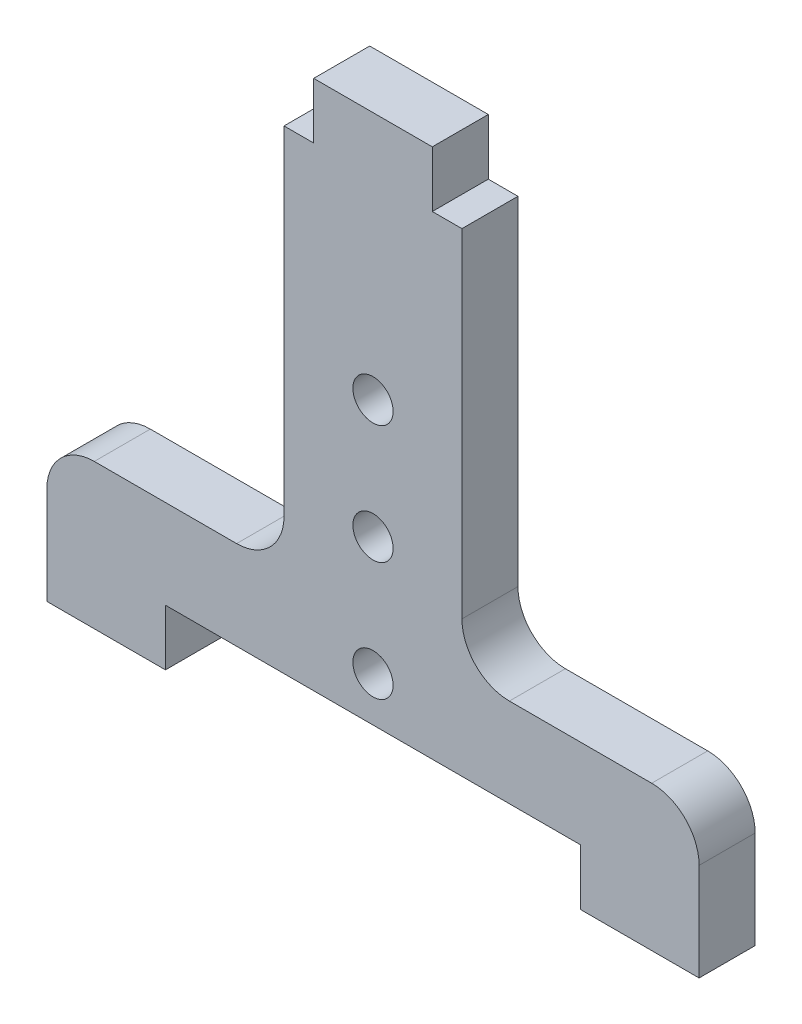
ISO-10303-21;
HEADER;
FILE_DESCRIPTION(('STEP AP214'),'2;1');
FILE_NAME('part.step','',(''),(''),'','','');
FILE_SCHEMA(('AUTOMOTIVE_DESIGN { 1 0 10303 214 1 1 1 1 }'));
ENDSEC;
DATA;
#1=APPLICATION_CONTEXT('core data for automotive mechanical design processes');
#2=APPLICATION_PROTOCOL_DEFINITION('international standard','automotive_design',2000,#1);
#3=PRODUCT_CONTEXT('',#1,'mechanical');
#4=PRODUCT('Part','Part','',(#3));
#5=PRODUCT_RELATED_PRODUCT_CATEGORY('part','',(#4));
#6=PRODUCT_DEFINITION_FORMATION('','',#4);
#7=PRODUCT_DEFINITION_CONTEXT('part definition',#1,'design');
#8=PRODUCT_DEFINITION('design','',#6,#7);
#9=PRODUCT_DEFINITION_SHAPE('','',#8);
#10=(LENGTH_UNIT() NAMED_UNIT(*) SI_UNIT(.MILLI.,.METRE.));
#11=(NAMED_UNIT(*) PLANE_ANGLE_UNIT() SI_UNIT($,.RADIAN.));
#12=(NAMED_UNIT(*) SI_UNIT($,.STERADIAN.) SOLID_ANGLE_UNIT());
#13=UNCERTAINTY_MEASURE_WITH_UNIT(LENGTH_MEASURE(1.E-05),#10,'distance_accuracy_value','');
#14=(GEOMETRIC_REPRESENTATION_CONTEXT(3) GLOBAL_UNCERTAINTY_ASSIGNED_CONTEXT((#13)) GLOBAL_UNIT_ASSIGNED_CONTEXT((#10,
#11,#12)) REPRESENTATION_CONTEXT('',''));
#15=CARTESIAN_POINT('',(0.,0.,0.));
#16=DIRECTION('',(0.,0.,1.));
#17=DIRECTION('',(1.,0.,0.));
#18=AXIS2_PLACEMENT_3D('',#15,#16,#17);
#19=CARTESIAN_POINT('',(-34.925,-25.4,5.999988));
#20=DIRECTION('',(0.,1.,0.));
#21=DIRECTION('',(0.,0.,1.));
#22=AXIS2_PLACEMENT_3D('',#19,#20,#21);
#23=PLANE('',#22);
#24=DIRECTION('',(1.,0.,0.));
#25=VECTOR('',#24,1.);
#26=CARTESIAN_POINT('',(-34.925,-25.4,0.));
#27=LINE('',#26,#25);
#28=CARTESIAN_POINT('',(-22.225,-25.4,0.));
#29=VERTEX_POINT('',#28);
#30=CARTESIAN_POINT('',(22.225,-25.4,0.));
#31=VERTEX_POINT('',#30);
#32=EDGE_CURVE('E250',#29,#31,#27,.T.);
#33=ORIENTED_EDGE('',*,*,#32,.T.);
#34=DIRECTION('',(0.,0.,1.));
#35=VECTOR('',#34,1.);
#36=CARTESIAN_POINT('',(22.225,-25.4,0.));
#37=LINE('',#36,#35);
#38=CARTESIAN_POINT('',(22.225,-25.4,5.999988));
#39=VERTEX_POINT('',#38);
#40=EDGE_CURVE('E304',#31,#39,#37,.T.);
#41=ORIENTED_EDGE('',*,*,#40,.T.);
#42=DIRECTION('',(1.,0.,0.));
#43=VECTOR('',#42,1.);
#44=CARTESIAN_POINT('',(-34.925,-25.4,5.999988));
#45=LINE('',#44,#43);
#46=CARTESIAN_POINT('',(-22.225,-25.4,5.999988));
#47=VERTEX_POINT('',#46);
#48=EDGE_CURVE('E199',#47,#39,#45,.T.);
#49=ORIENTED_EDGE('',*,*,#48,.F.);
#50=DIRECTION('',(0.,0.,1.));
#51=VECTOR('',#50,1.);
#52=CARTESIAN_POINT('',(-22.225,-25.4,0.));
#53=LINE('',#52,#51);
#54=EDGE_CURVE('E247',#29,#47,#53,.T.);
#55=ORIENTED_EDGE('',*,*,#54,.F.);
#56=EDGE_LOOP('',(#33,#41,#49,#55));
#57=FACE_BOUND('',#56,.T.);
#58=ADVANCED_FACE('F33',(#57),#23,.F.);
#59=CARTESIAN_POINT('',(-34.925,25.4,5.999988));
#60=DIRECTION('',(0.,-1.,0.));
#61=DIRECTION('',(0.,0.,-1.));
#62=AXIS2_PLACEMENT_3D('',#59,#60,#61);
#63=PLANE('',#62);
#64=DIRECTION('',(-1.,0.,0.));
#65=VECTOR('',#64,1.);
#66=CARTESIAN_POINT('',(-34.925,25.4,0.));
#67=LINE('',#66,#65);
#68=CARTESIAN_POINT('',(-6.35,25.4,0.));
#69=VERTEX_POINT('',#68);
#70=CARTESIAN_POINT('',(-9.525,25.4,0.));
#71=VERTEX_POINT('',#70);
#72=EDGE_CURVE('E218',#69,#71,#67,.T.);
#73=ORIENTED_EDGE('',*,*,#72,.T.);
#74=DIRECTION('',(0.,0.,1.));
#75=VECTOR('',#74,1.);
#76=CARTESIAN_POINT('',(-9.525,25.4,-4.99999999997031E-05));
#77=LINE('',#76,#75);
#78=CARTESIAN_POINT('',(-9.525,25.4,5.999988));
#79=VERTEX_POINT('',#78);
#80=EDGE_CURVE('E293',#71,#79,#77,.T.);
#81=ORIENTED_EDGE('',*,*,#80,.T.);
#82=DIRECTION('',(-1.,0.,0.));
#83=VECTOR('',#82,1.);
#84=CARTESIAN_POINT('',(-34.925,25.4,5.999988));
#85=LINE('',#84,#83);
#86=CARTESIAN_POINT('',(-6.35,25.4,5.999988));
#87=VERTEX_POINT('',#86);
#88=EDGE_CURVE('E197',#87,#79,#85,.T.);
#89=ORIENTED_EDGE('',*,*,#88,.F.);
#90=DIRECTION('',(0.,0.,1.));
#91=VECTOR('',#90,1.);
#92=CARTESIAN_POINT('',(-6.35,25.4,0.));
#93=LINE('',#92,#91);
#94=EDGE_CURVE('E230',#69,#87,#93,.T.);
#95=ORIENTED_EDGE('',*,*,#94,.F.);
#96=EDGE_LOOP('',(#73,#81,#89,#95));
#97=FACE_BOUND('',#96,.T.);
#98=ADVANCED_FACE('F372',(#97),#63,.F.);
#99=CARTESIAN_POINT('',(34.925,-25.4,5.999988));
#100=DIRECTION('',(-1.,0.,0.));
#101=DIRECTION('',(0.,0.,1.));
#102=AXIS2_PLACEMENT_3D('',#99,#100,#101);
#103=PLANE('',#102);
#104=DIRECTION('',(0.,1.,0.));
#105=VECTOR('',#104,1.);
#106=CARTESIAN_POINT('',(34.925,-25.4,0.));
#107=LINE('',#106,#105);
#108=CARTESIAN_POINT('',(34.925,-31.399988,0.));
#109=VERTEX_POINT('',#108);
#110=CARTESIAN_POINT('',(34.925,-20.955,0.));
#111=VERTEX_POINT('',#110);
#112=EDGE_CURVE('E259',#109,#111,#107,.T.);
#113=ORIENTED_EDGE('',*,*,#112,.T.);
#114=DIRECTION('',(0.,0.,1.));
#115=VECTOR('',#114,1.);
#116=CARTESIAN_POINT('',(34.925,-20.955,5.999988));
#117=LINE('',#116,#115);
#118=CARTESIAN_POINT('',(34.925,-20.955,5.999988));
#119=VERTEX_POINT('',#118);
#120=EDGE_CURVE('E446',#111,#119,#117,.T.);
#121=ORIENTED_EDGE('',*,*,#120,.T.);
#122=DIRECTION('',(0.,1.,0.));
#123=VECTOR('',#122,1.);
#124=CARTESIAN_POINT('',(34.925,-25.4,5.999988));
#125=LINE('',#124,#123);
#126=CARTESIAN_POINT('',(34.925,-31.399988,5.999988));
#127=VERTEX_POINT('',#126);
#128=EDGE_CURVE('E202',#127,#119,#125,.T.);
#129=ORIENTED_EDGE('',*,*,#128,.F.);
#130=DIRECTION('',(0.,0.,1.));
#131=VECTOR('',#130,1.);
#132=CARTESIAN_POINT('',(34.925,-31.399988,0.));
#133=LINE('',#132,#131);
#134=EDGE_CURVE('E309',#109,#127,#133,.T.);
#135=ORIENTED_EDGE('',*,*,#134,.F.);
#136=EDGE_LOOP('',(#113,#121,#129,#135));
#137=FACE_BOUND('',#136,.T.);
#138=ADVANCED_FACE('F378',(#137),#103,.F.);
#139=CARTESIAN_POINT('',(9.525,25.4,5.999988));
#140=VERTEX_POINT('',#139);
#141=CARTESIAN_POINT('',(6.35,25.4,5.999988));
#142=VERTEX_POINT('',#141);
#143=EDGE_CURVE('E187',#140,#142,#85,.T.);
#144=ORIENTED_EDGE('',*,*,#143,.F.);
#145=DIRECTION('',(0.,0.,1.));
#146=VECTOR('',#145,1.);
#147=CARTESIAN_POINT('',(9.525,25.4,-4.99999999997031E-05));
#148=LINE('',#147,#146);
#149=CARTESIAN_POINT('',(9.525,25.4,0.));
#150=VERTEX_POINT('',#149);
#151=EDGE_CURVE('E170',#150,#140,#148,.T.);
#152=ORIENTED_EDGE('',*,*,#151,.F.);
#153=CARTESIAN_POINT('',(6.35,25.4,0.));
#154=VERTEX_POINT('',#153);
#155=EDGE_CURVE('E256',#150,#154,#67,.T.);
#156=ORIENTED_EDGE('',*,*,#155,.T.);
#157=DIRECTION('',(0.,0.,1.));
#158=VECTOR('',#157,1.);
#159=CARTESIAN_POINT('',(6.35,25.4,0.));
#160=LINE('',#159,#158);
#161=EDGE_CURVE('E195',#154,#142,#160,.T.);
#162=ORIENTED_EDGE('',*,*,#161,.T.);
#163=EDGE_LOOP('',(#144,#152,#156,#162));
#164=FACE_BOUND('',#163,.T.);
#165=ADVANCED_FACE('F193',(#164),#63,.F.);
#166=CARTESIAN_POINT('',(-34.925,-25.4,5.999988));
#167=DIRECTION('',(1.,0.,0.));
#168=DIRECTION('',(0.,0.,-1.));
#169=AXIS2_PLACEMENT_3D('',#166,#167,#168);
#170=PLANE('',#169);
#171=DIRECTION('',(0.,-1.,0.));
#172=VECTOR('',#171,1.);
#173=CARTESIAN_POINT('',(-34.925,-25.4,5.999988));
#174=LINE('',#173,#172);
#175=CARTESIAN_POINT('',(-34.925,-20.955,5.999988));
#176=VERTEX_POINT('',#175);
#177=CARTESIAN_POINT('',(-34.925,-31.399988,5.999988));
#178=VERTEX_POINT('',#177);
#179=EDGE_CURVE('E196',#176,#178,#174,.T.);
#180=ORIENTED_EDGE('',*,*,#179,.F.);
#181=DIRECTION('',(0.,0.,1.));
#182=VECTOR('',#181,1.);
#183=CARTESIAN_POINT('',(-34.925,-20.955,5.999988));
#184=LINE('',#183,#182);
#185=CARTESIAN_POINT('',(-34.925,-20.955,0.));
#186=VERTEX_POINT('',#185);
#187=EDGE_CURVE('E407',#176,#186,#184,.F.);
#188=ORIENTED_EDGE('',*,*,#187,.T.);
#189=DIRECTION('',(0.,-1.,0.));
#190=VECTOR('',#189,1.);
#191=CARTESIAN_POINT('',(-34.925,-25.4,0.));
#192=LINE('',#191,#190);
#193=CARTESIAN_POINT('',(-34.925,-31.399988,0.));
#194=VERTEX_POINT('',#193);
#195=EDGE_CURVE('E252',#186,#194,#192,.T.);
#196=ORIENTED_EDGE('',*,*,#195,.T.);
#197=DIRECTION('',(0.,0.,1.));
#198=VECTOR('',#197,1.);
#199=CARTESIAN_POINT('',(-34.925,-31.399988,0.));
#200=LINE('',#199,#198);
#201=EDGE_CURVE('E334',#194,#178,#200,.T.);
#202=ORIENTED_EDGE('',*,*,#201,.T.);
#203=EDGE_LOOP('',(#180,#188,#196,#202));
#204=FACE_BOUND('',#203,.T.);
#205=ADVANCED_FACE('F384',(#204),#170,.F.);
#206=CARTESIAN_POINT('',(0.,0.,5.999988));
#207=DIRECTION('',(0.,0.,-1.));
#208=DIRECTION('',(-1.,0.,0.));
#209=AXIS2_PLACEMENT_3D('',#206,#207,#208);
#210=PLANE('',#209);
#211=CARTESIAN_POINT('',(0.,-20.6375,5.999988));
#212=DIRECTION('',(0.,0.,-1.));
#213=DIRECTION('',(-1.,0.,0.));
#214=AXIS2_PLACEMENT_3D('',#211,#212,#213);
#215=CIRCLE('',#214,2.15264999999999);
#216=CARTESIAN_POINT('',(-2.15264999999999,-20.6375,5.999988));
#217=VERTEX_POINT('',#216);
#218=EDGE_CURVE('E473',#217,#217,#215,.T.);
#219=ORIENTED_EDGE('',*,*,#218,.T.);
#220=EDGE_LOOP('',(#219));
#221=FACE_BOUND('',#220,.T.);
#222=CARTESIAN_POINT('',(0.,-7.9375,5.999988));
#223=DIRECTION('',(0.,0.,-1.));
#224=DIRECTION('',(-1.,0.,0.));
#225=AXIS2_PLACEMENT_3D('',#222,#223,#224);
#226=CIRCLE('',#225,2.15264999999999);
#227=CARTESIAN_POINT('',(-2.15264999999995,-7.9375,5.999988));
#228=VERTEX_POINT('',#227);
#229=EDGE_CURVE('E263',#228,#228,#226,.T.);
#230=ORIENTED_EDGE('',*,*,#229,.T.);
#231=EDGE_LOOP('',(#230));
#232=FACE_BOUND('',#231,.T.);
#233=CARTESIAN_POINT('',(0.,4.7625,5.999988));
#234=DIRECTION('',(0.,0.,-1.));
#235=DIRECTION('',(-1.,0.,0.));
#236=AXIS2_PLACEMENT_3D('',#233,#234,#235);
#237=CIRCLE('',#236,2.15264999999999);
#238=CARTESIAN_POINT('',(-2.1526499999999,4.7625,5.999988));
#239=VERTEX_POINT('',#238);
#240=EDGE_CURVE('E274',#239,#239,#237,.T.);
#241=ORIENTED_EDGE('',*,*,#240,.T.);
#242=EDGE_LOOP('',(#241));
#243=FACE_BOUND('',#242,.T.);
#244=ORIENTED_EDGE('',*,*,#128,.T.);
#245=CARTESIAN_POINT('',(29.845,-20.955,5.999988));
#246=DIRECTION('',(0.,0.,-1.));
#247=DIRECTION('',(-1.,0.,0.));
#248=AXIS2_PLACEMENT_3D('',#245,#246,#247);
#249=CIRCLE('',#248,5.08);
#250=CARTESIAN_POINT('',(29.845,-15.875,5.999988));
#251=VERTEX_POINT('',#250);
#252=EDGE_CURVE('E411',#119,#251,#249,.F.);
#253=ORIENTED_EDGE('',*,*,#252,.T.);
#254=DIRECTION('',(1.,0.,0.));
#255=VECTOR('',#254,1.);
#256=CARTESIAN_POINT('',(9.52500000000009,-15.875,5.999988));
#257=LINE('',#256,#255);
#258=CARTESIAN_POINT('',(14.6050000000001,-15.875,5.999988));
#259=VERTEX_POINT('',#258);
#260=EDGE_CURVE('E181',#259,#251,#257,.T.);
#261=ORIENTED_EDGE('',*,*,#260,.F.);
#262=CARTESIAN_POINT('',(14.6050000000001,-10.795,5.999988));
#263=DIRECTION('',(0.,0.,-1.));
#264=DIRECTION('',(-1.,0.,0.));
#265=AXIS2_PLACEMENT_3D('',#262,#263,#264);
#266=CIRCLE('',#265,5.08);
#267=CARTESIAN_POINT('',(9.52500000000008,-10.795,5.999988));
#268=VERTEX_POINT('',#267);
#269=EDGE_CURVE('E190',#259,#268,#266,.T.);
#270=ORIENTED_EDGE('',*,*,#269,.T.);
#271=DIRECTION('',(0.,-1.,0.));
#272=VECTOR('',#271,1.);
#273=CARTESIAN_POINT('',(9.525,25.4,5.999988));
#274=LINE('',#273,#272);
#275=EDGE_CURVE('E173',#140,#268,#274,.T.);
#276=ORIENTED_EDGE('',*,*,#275,.F.);
#277=ORIENTED_EDGE('',*,*,#143,.T.);
#278=DIRECTION('',(0.,1.,0.));
#279=VECTOR('',#278,1.);
#280=CARTESIAN_POINT('',(6.35,25.4,5.999988));
#281=LINE('',#280,#279);
#282=CARTESIAN_POINT('',(6.35,31.399988,5.999988));
#283=VERTEX_POINT('',#282);
#284=EDGE_CURVE('E221',#142,#283,#281,.T.);
#285=ORIENTED_EDGE('',*,*,#284,.T.);
#286=DIRECTION('',(-1.,0.,0.));
#287=VECTOR('',#286,1.);
#288=CARTESIAN_POINT('',(-6.35,31.399988,5.999988));
#289=LINE('',#288,#287);
#290=CARTESIAN_POINT('',(-6.35,31.399988,5.999988));
#291=VERTEX_POINT('',#290);
#292=EDGE_CURVE('E223',#283,#291,#289,.T.);
#293=ORIENTED_EDGE('',*,*,#292,.T.);
#294=DIRECTION('',(0.,-1.,0.));
#295=VECTOR('',#294,1.);
#296=CARTESIAN_POINT('',(-6.35,25.4,5.999988));
#297=LINE('',#296,#295);
#298=EDGE_CURVE('E224',#291,#87,#297,.T.);
#299=ORIENTED_EDGE('',*,*,#298,.T.);
#300=ORIENTED_EDGE('',*,*,#88,.T.);
#301=DIRECTION('',(0.,1.,0.));
#302=VECTOR('',#301,1.);
#303=CARTESIAN_POINT('',(-9.525,25.4,5.999988));
#304=LINE('',#303,#302);
#305=CARTESIAN_POINT('',(-9.525,-10.795,5.999988));
#306=VERTEX_POINT('',#305);
#307=EDGE_CURVE('E281',#306,#79,#304,.T.);
#308=ORIENTED_EDGE('',*,*,#307,.F.);
#309=CARTESIAN_POINT('',(-14.605,-10.795,5.999988));
#310=DIRECTION('',(0.,0.,-1.));
#311=DIRECTION('',(-1.,0.,0.));
#312=AXIS2_PLACEMENT_3D('',#309,#310,#311);
#313=CIRCLE('',#312,5.08);
#314=CARTESIAN_POINT('',(-14.605,-15.875,5.999988));
#315=VERTEX_POINT('',#314);
#316=EDGE_CURVE('E41',#306,#315,#313,.T.);
#317=ORIENTED_EDGE('',*,*,#316,.T.);
#318=DIRECTION('',(1.,0.,0.));
#319=VECTOR('',#318,1.);
#320=CARTESIAN_POINT('',(-9.525,-15.875,5.999988));
#321=LINE('',#320,#319);
#322=CARTESIAN_POINT('',(-29.845,-15.875,5.999988));
#323=VERTEX_POINT('',#322);
#324=EDGE_CURVE('E276',#323,#315,#321,.T.);
#325=ORIENTED_EDGE('',*,*,#324,.F.);
#326=CARTESIAN_POINT('',(-29.845,-20.955,5.999988));
#327=DIRECTION('',(0.,0.,-1.));
#328=DIRECTION('',(-1.,0.,0.));
#329=AXIS2_PLACEMENT_3D('',#326,#327,#328);
#330=CIRCLE('',#329,5.08);
#331=EDGE_CURVE('E415',#323,#176,#330,.F.);
#332=ORIENTED_EDGE('',*,*,#331,.T.);
#333=ORIENTED_EDGE('',*,*,#179,.T.);
#334=DIRECTION('',(1.,0.,0.));
#335=VECTOR('',#334,1.);
#336=CARTESIAN_POINT('',(-34.925,-31.399988,5.999988));
#337=LINE('',#336,#335);
#338=CARTESIAN_POINT('',(-22.225,-31.399988,5.999988));
#339=VERTEX_POINT('',#338);
#340=EDGE_CURVE('E312',#178,#339,#337,.T.);
#341=ORIENTED_EDGE('',*,*,#340,.T.);
#342=DIRECTION('',(0.,1.,0.));
#343=VECTOR('',#342,1.);
#344=CARTESIAN_POINT('',(-22.225,-25.4,5.999988));
#345=LINE('',#344,#343);
#346=EDGE_CURVE('E320',#339,#47,#345,.T.);
#347=ORIENTED_EDGE('',*,*,#346,.T.);
#348=ORIENTED_EDGE('',*,*,#48,.T.);
#349=DIRECTION('',(0.,-1.,0.));
#350=VECTOR('',#349,1.);
#351=CARTESIAN_POINT('',(22.225,-25.4,5.999988));
#352=LINE('',#351,#350);
#353=CARTESIAN_POINT('',(22.225,-31.399988,5.999988));
#354=VERTEX_POINT('',#353);
#355=EDGE_CURVE('E296',#39,#354,#352,.T.);
#356=ORIENTED_EDGE('',*,*,#355,.T.);
#357=DIRECTION('',(1.,0.,0.));
#358=VECTOR('',#357,1.);
#359=CARTESIAN_POINT('',(34.925,-31.399988,5.999988));
#360=LINE('',#359,#358);
#361=EDGE_CURVE('E301',#354,#127,#360,.T.);
#362=ORIENTED_EDGE('',*,*,#361,.T.);
#363=EDGE_LOOP('',(#244,#253,#261,#270,#276,#277,#285,#293,#299,#300,#308,#317,#325,#332,#333,
#341,#347,#348,#356,#362));
#364=FACE_BOUND('',#363,.T.);
#365=ADVANCED_FACE('F185',(#221,#232,#243,#364),#210,.F.);
#366=CARTESIAN_POINT('',(0.,0.,0.));
#367=DIRECTION('',(0.,0.,-1.));
#368=DIRECTION('',(-1.,0.,0.));
#369=AXIS2_PLACEMENT_3D('',#366,#367,#368);
#370=PLANE('',#369);
#371=DIRECTION('',(-1.,0.,0.));
#372=VECTOR('',#371,1.);
#373=CARTESIAN_POINT('',(0.,-15.875,0.));
#374=LINE('',#373,#372);
#375=CARTESIAN_POINT('',(29.845,-15.875,0.));
#376=VERTEX_POINT('',#375);
#377=CARTESIAN_POINT('',(14.6050000000001,-15.875,0.));
#378=VERTEX_POINT('',#377);
#379=EDGE_CURVE('E207',#376,#378,#374,.T.);
#380=ORIENTED_EDGE('',*,*,#379,.F.);
#381=CARTESIAN_POINT('',(29.845,-20.955,0.));
#382=DIRECTION('',(0.,0.,-1.));
#383=DIRECTION('',(-1.,0.,0.));
#384=AXIS2_PLACEMENT_3D('',#381,#382,#383);
#385=CIRCLE('',#384,5.08);
#386=EDGE_CURVE('E410',#376,#111,#385,.T.);
#387=ORIENTED_EDGE('',*,*,#386,.T.);
#388=ORIENTED_EDGE('',*,*,#112,.F.);
#389=DIRECTION('',(1.,0.,0.));
#390=VECTOR('',#389,1.);
#391=CARTESIAN_POINT('',(34.925,-31.399988,0.));
#392=LINE('',#391,#390);
#393=CARTESIAN_POINT('',(22.225,-31.399988,0.));
#394=VERTEX_POINT('',#393);
#395=EDGE_CURVE('E300',#394,#109,#392,.T.);
#396=ORIENTED_EDGE('',*,*,#395,.F.);
#397=DIRECTION('',(0.,-1.,0.));
#398=VECTOR('',#397,1.);
#399=CARTESIAN_POINT('',(22.225,-25.4,0.));
#400=LINE('',#399,#398);
#401=EDGE_CURVE('E297',#31,#394,#400,.T.);
#402=ORIENTED_EDGE('',*,*,#401,.F.);
#403=ORIENTED_EDGE('',*,*,#32,.F.);
#404=DIRECTION('',(0.,1.,0.));
#405=VECTOR('',#404,1.);
#406=CARTESIAN_POINT('',(-22.225,-25.4,0.));
#407=LINE('',#406,#405);
#408=CARTESIAN_POINT('',(-22.225,-31.399988,0.));
#409=VERTEX_POINT('',#408);
#410=EDGE_CURVE('E319',#409,#29,#407,.T.);
#411=ORIENTED_EDGE('',*,*,#410,.F.);
#412=DIRECTION('',(1.,0.,0.));
#413=VECTOR('',#412,1.);
#414=CARTESIAN_POINT('',(-34.925,-31.399988,0.));
#415=LINE('',#414,#413);
#416=EDGE_CURVE('E316',#194,#409,#415,.T.);
#417=ORIENTED_EDGE('',*,*,#416,.F.);
#418=ORIENTED_EDGE('',*,*,#195,.F.);
#419=CARTESIAN_POINT('',(-29.845,-20.955,0.));
#420=DIRECTION('',(0.,0.,-1.));
#421=DIRECTION('',(-1.,0.,0.));
#422=AXIS2_PLACEMENT_3D('',#419,#420,#421);
#423=CIRCLE('',#422,5.08);
#424=CARTESIAN_POINT('',(-29.845,-15.875,0.));
#425=VERTEX_POINT('',#424);
#426=EDGE_CURVE('E52',#186,#425,#423,.T.);
#427=ORIENTED_EDGE('',*,*,#426,.T.);
#428=DIRECTION('',(-1.,0.,0.));
#429=VECTOR('',#428,1.);
#430=CARTESIAN_POINT('',(0.,-15.875,0.));
#431=LINE('',#430,#429);
#432=CARTESIAN_POINT('',(-14.605,-15.875,0.));
#433=VERTEX_POINT('',#432);
#434=EDGE_CURVE('E267',#433,#425,#431,.T.);
#435=ORIENTED_EDGE('',*,*,#434,.F.);
#436=CARTESIAN_POINT('',(-14.605,-10.795,0.));
#437=DIRECTION('',(0.,0.,-1.));
#438=DIRECTION('',(-1.,0.,0.));
#439=AXIS2_PLACEMENT_3D('',#436,#437,#438);
#440=CIRCLE('',#439,5.08);
#441=CARTESIAN_POINT('',(-9.525,-10.795,0.));
#442=VERTEX_POINT('',#441);
#443=EDGE_CURVE('E11',#433,#442,#440,.F.);
#444=ORIENTED_EDGE('',*,*,#443,.T.);
#445=DIRECTION('',(0.,-1.,0.));
#446=VECTOR('',#445,1.);
#447=CARTESIAN_POINT('',(-9.525,0.,0.));
#448=LINE('',#447,#446);
#449=EDGE_CURVE('E265',#71,#442,#448,.T.);
#450=ORIENTED_EDGE('',*,*,#449,.F.);
#451=ORIENTED_EDGE('',*,*,#72,.F.);
#452=DIRECTION('',(0.,-1.,0.));
#453=VECTOR('',#452,1.);
#454=CARTESIAN_POINT('',(-6.35,25.4,0.));
#455=LINE('',#454,#453);
#456=CARTESIAN_POINT('',(-6.35,31.399988,0.));
#457=VERTEX_POINT('',#456);
#458=EDGE_CURVE('E241',#457,#69,#455,.T.);
#459=ORIENTED_EDGE('',*,*,#458,.F.);
#460=DIRECTION('',(-1.,0.,0.));
#461=VECTOR('',#460,1.);
#462=CARTESIAN_POINT('',(-6.35,31.399988,0.));
#463=LINE('',#462,#461);
#464=CARTESIAN_POINT('',(6.35,31.399988,0.));
#465=VERTEX_POINT('',#464);
#466=EDGE_CURVE('E239',#465,#457,#463,.T.);
#467=ORIENTED_EDGE('',*,*,#466,.F.);
#468=DIRECTION('',(0.,1.,0.));
#469=VECTOR('',#468,1.);
#470=CARTESIAN_POINT('',(6.35,25.4,0.));
#471=LINE('',#470,#469);
#472=EDGE_CURVE('E231',#154,#465,#471,.T.);
#473=ORIENTED_EDGE('',*,*,#472,.F.);
#474=ORIENTED_EDGE('',*,*,#155,.F.);
#475=DIRECTION('',(0.,1.,0.));
#476=VECTOR('',#475,1.);
#477=CARTESIAN_POINT('',(9.52500000000006,0.,0.));
#478=LINE('',#477,#476);
#479=CARTESIAN_POINT('',(9.52500000000008,-10.795,0.));
#480=VERTEX_POINT('',#479);
#481=EDGE_CURVE('E176',#480,#150,#478,.T.);
#482=ORIENTED_EDGE('',*,*,#481,.F.);
#483=CARTESIAN_POINT('',(14.6050000000001,-10.795,0.));
#484=DIRECTION('',(0.,0.,-1.));
#485=DIRECTION('',(-1.,0.,0.));
#486=AXIS2_PLACEMENT_3D('',#483,#484,#485);
#487=CIRCLE('',#486,5.08);
#488=EDGE_CURVE('E425',#480,#378,#487,.F.);
#489=ORIENTED_EDGE('',*,*,#488,.T.);
#490=EDGE_LOOP('',(#380,#387,#388,#396,#402,#403,#411,#417,#418,#427,#435,#444,#450,#451,#459,
#467,#473,#474,#482,#489));
#491=FACE_BOUND('',#490,.T.);
#492=CARTESIAN_POINT('',(0.,-20.6375,0.));
#493=DIRECTION('',(0.,0.,-1.));
#494=DIRECTION('',(-1.,0.,0.));
#495=AXIS2_PLACEMENT_3D('',#492,#493,#494);
#496=CIRCLE('',#495,2.15264999999999);
#497=CARTESIAN_POINT('',(-2.15264999999999,-20.6375,0.));
#498=VERTEX_POINT('',#497);
#499=EDGE_CURVE('E180',#498,#498,#496,.T.);
#500=ORIENTED_EDGE('',*,*,#499,.F.);
#501=EDGE_LOOP('',(#500));
#502=FACE_BOUND('',#501,.T.);
#503=CARTESIAN_POINT('',(0.,-7.9375,0.));
#504=DIRECTION('',(0.,0.,-1.));
#505=DIRECTION('',(-1.,0.,0.));
#506=AXIS2_PLACEMENT_3D('',#503,#504,#505);
#507=CIRCLE('',#506,2.15264999999999);
#508=CARTESIAN_POINT('',(-2.15264999999994,-7.9375,0.));
#509=VERTEX_POINT('',#508);
#510=EDGE_CURVE('E288',#509,#509,#507,.T.);
#511=ORIENTED_EDGE('',*,*,#510,.F.);
#512=EDGE_LOOP('',(#511));
#513=FACE_BOUND('',#512,.T.);
#514=CARTESIAN_POINT('',(0.,4.7625,0.));
#515=DIRECTION('',(0.,0.,-1.));
#516=DIRECTION('',(-1.,0.,0.));
#517=AXIS2_PLACEMENT_3D('',#514,#515,#516);
#518=CIRCLE('',#517,2.15264999999999);
#519=CARTESIAN_POINT('',(-2.1526499999999,4.7625,0.));
#520=VERTEX_POINT('',#519);
#521=EDGE_CURVE('E277',#520,#520,#518,.T.);
#522=ORIENTED_EDGE('',*,*,#521,.F.);
#523=EDGE_LOOP('',(#522));
#524=FACE_BOUND('',#523,.T.);
#525=ADVANCED_FACE('F367',(#491,#502,#513,#524),#370,.T.);
#526=CARTESIAN_POINT('',(-6.35,25.4,0.));
#527=DIRECTION('',(-1.,0.,0.));
#528=DIRECTION('',(0.,0.,1.));
#529=AXIS2_PLACEMENT_3D('',#526,#527,#528);
#530=PLANE('',#529);
#531=ORIENTED_EDGE('',*,*,#298,.F.);
#532=DIRECTION('',(0.,0.,1.));
#533=VECTOR('',#532,1.);
#534=CARTESIAN_POINT('',(-6.35,31.399988,0.));
#535=LINE('',#534,#533);
#536=EDGE_CURVE('E347',#457,#291,#535,.T.);
#537=ORIENTED_EDGE('',*,*,#536,.F.);
#538=ORIENTED_EDGE('',*,*,#458,.T.);
#539=ORIENTED_EDGE('',*,*,#94,.T.);
#540=EDGE_LOOP('',(#531,#537,#538,#539));
#541=FACE_BOUND('',#540,.T.);
#542=ADVANCED_FACE('F359',(#541),#530,.T.);
#543=CARTESIAN_POINT('',(-6.35,31.399988,0.));
#544=DIRECTION('',(0.,1.,0.));
#545=DIRECTION('',(0.,0.,1.));
#546=AXIS2_PLACEMENT_3D('',#543,#544,#545);
#547=PLANE('',#546);
#548=ORIENTED_EDGE('',*,*,#292,.F.);
#549=DIRECTION('',(0.,0.,1.));
#550=VECTOR('',#549,1.);
#551=CARTESIAN_POINT('',(6.35,31.399988,0.));
#552=LINE('',#551,#550);
#553=EDGE_CURVE('E229',#465,#283,#552,.T.);
#554=ORIENTED_EDGE('',*,*,#553,.F.);
#555=ORIENTED_EDGE('',*,*,#466,.T.);
#556=ORIENTED_EDGE('',*,*,#536,.T.);
#557=EDGE_LOOP('',(#548,#554,#555,#556));
#558=FACE_BOUND('',#557,.T.);
#559=ADVANCED_FACE('F357',(#558),#547,.T.);
#560=CARTESIAN_POINT('',(6.35,25.4,0.));
#561=DIRECTION('',(1.,0.,0.));
#562=DIRECTION('',(0.,0.,-1.));
#563=AXIS2_PLACEMENT_3D('',#560,#561,#562);
#564=PLANE('',#563);
#565=ORIENTED_EDGE('',*,*,#284,.F.);
#566=ORIENTED_EDGE('',*,*,#161,.F.);
#567=ORIENTED_EDGE('',*,*,#472,.T.);
#568=ORIENTED_EDGE('',*,*,#553,.T.);
#569=EDGE_LOOP('',(#565,#566,#567,#568));
#570=FACE_BOUND('',#569,.T.);
#571=ADVANCED_FACE('F354',(#570),#564,.T.);
#572=CARTESIAN_POINT('',(-22.225,-25.4,0.));
#573=DIRECTION('',(1.,0.,0.));
#574=DIRECTION('',(0.,0.,-1.));
#575=AXIS2_PLACEMENT_3D('',#572,#573,#574);
#576=PLANE('',#575);
#577=ORIENTED_EDGE('',*,*,#346,.F.);
#578=DIRECTION('',(0.,0.,1.));
#579=VECTOR('',#578,1.);
#580=CARTESIAN_POINT('',(-22.225,-31.399988,0.));
#581=LINE('',#580,#579);
#582=EDGE_CURVE('E325',#409,#339,#581,.T.);
#583=ORIENTED_EDGE('',*,*,#582,.F.);
#584=ORIENTED_EDGE('',*,*,#410,.T.);
#585=ORIENTED_EDGE('',*,*,#54,.T.);
#586=EDGE_LOOP('',(#577,#583,#584,#585));
#587=FACE_BOUND('',#586,.T.);
#588=ADVANCED_FACE('F365',(#587),#576,.T.);
#589=CARTESIAN_POINT('',(-34.925,-31.399988,0.));
#590=DIRECTION('',(0.,-1.,0.));
#591=DIRECTION('',(0.,0.,-1.));
#592=AXIS2_PLACEMENT_3D('',#589,#590,#591);
#593=PLANE('',#592);
#594=ORIENTED_EDGE('',*,*,#340,.F.);
#595=ORIENTED_EDGE('',*,*,#201,.F.);
#596=ORIENTED_EDGE('',*,*,#416,.T.);
#597=ORIENTED_EDGE('',*,*,#582,.T.);
#598=EDGE_LOOP('',(#594,#595,#596,#597));
#599=FACE_BOUND('',#598,.T.);
#600=ADVANCED_FACE('F453',(#599),#593,.T.);
#601=CARTESIAN_POINT('',(34.925,-31.399988,0.));
#602=DIRECTION('',(0.,-1.,0.));
#603=DIRECTION('',(0.,0.,-1.));
#604=AXIS2_PLACEMENT_3D('',#601,#602,#603);
#605=PLANE('',#604);
#606=ORIENTED_EDGE('',*,*,#361,.F.);
#607=DIRECTION('',(0.,0.,1.));
#608=VECTOR('',#607,1.);
#609=CARTESIAN_POINT('',(22.225,-31.399988,0.));
#610=LINE('',#609,#608);
#611=EDGE_CURVE('E313',#394,#354,#610,.T.);
#612=ORIENTED_EDGE('',*,*,#611,.F.);
#613=ORIENTED_EDGE('',*,*,#395,.T.);
#614=ORIENTED_EDGE('',*,*,#134,.T.);
#615=EDGE_LOOP('',(#606,#612,#613,#614));
#616=FACE_BOUND('',#615,.T.);
#617=ADVANCED_FACE('F464',(#616),#605,.T.);
#618=CARTESIAN_POINT('',(22.225,-25.4,0.));
#619=DIRECTION('',(-1.,0.,0.));
#620=DIRECTION('',(0.,0.,1.));
#621=AXIS2_PLACEMENT_3D('',#618,#619,#620);
#622=PLANE('',#621);
#623=ORIENTED_EDGE('',*,*,#355,.F.);
#624=ORIENTED_EDGE('',*,*,#40,.F.);
#625=ORIENTED_EDGE('',*,*,#401,.T.);
#626=ORIENTED_EDGE('',*,*,#611,.T.);
#627=EDGE_LOOP('',(#623,#624,#625,#626));
#628=FACE_BOUND('',#627,.T.);
#629=ADVANCED_FACE('F461',(#628),#622,.T.);
#630=CARTESIAN_POINT('',(-9.525,25.4,-4.99999999997031E-05));
#631=DIRECTION('',(1.,0.,0.));
#632=DIRECTION('',(0.,1.,0.));
#633=AXIS2_PLACEMENT_3D('',#630,#631,#632);
#634=PLANE('',#633);
#635=ORIENTED_EDGE('',*,*,#449,.T.);
#636=DIRECTION('',(0.,0.,1.));
#637=VECTOR('',#636,1.);
#638=CARTESIAN_POINT('',(-9.525,-10.795,5.999988));
#639=LINE('',#638,#637);
#640=EDGE_CURVE('E422',#442,#306,#639,.T.);
#641=ORIENTED_EDGE('',*,*,#640,.T.);
#642=ORIENTED_EDGE('',*,*,#307,.T.);
#643=ORIENTED_EDGE('',*,*,#80,.F.);
#644=EDGE_LOOP('',(#635,#641,#642,#643));
#645=FACE_BOUND('',#644,.T.);
#646=ADVANCED_FACE('F431',(#645),#634,.F.);
#647=CARTESIAN_POINT('',(-9.525,-15.875,-4.99999999997031E-05));
#648=DIRECTION('',(0.,-1.,0.));
#649=DIRECTION('',(0.,0.,-1.));
#650=AXIS2_PLACEMENT_3D('',#647,#648,#649);
#651=PLANE('',#650);
#652=ORIENTED_EDGE('',*,*,#434,.T.);
#653=DIRECTION('',(0.,0.,1.));
#654=VECTOR('',#653,1.);
#655=CARTESIAN_POINT('',(-29.845,-15.875,-4.99999999997031E-05));
#656=LINE('',#655,#654);
#657=EDGE_CURVE('E409',#425,#323,#656,.T.);
#658=ORIENTED_EDGE('',*,*,#657,.T.);
#659=ORIENTED_EDGE('',*,*,#324,.T.);
#660=DIRECTION('',(0.,0.,1.));
#661=VECTOR('',#660,1.);
#662=CARTESIAN_POINT('',(-14.605,-15.875,0.));
#663=LINE('',#662,#661);
#664=EDGE_CURVE('E413',#315,#433,#663,.F.);
#665=ORIENTED_EDGE('',*,*,#664,.T.);
#666=EDGE_LOOP('',(#652,#658,#659,#665));
#667=FACE_BOUND('',#666,.T.);
#668=ADVANCED_FACE('F430',(#667),#651,.F.);
#669=CARTESIAN_POINT('',(0.,4.7625,0.));
#670=DIRECTION('',(0.,0.,-1.));
#671=DIRECTION('',(-1.,0.,0.));
#672=AXIS2_PLACEMENT_3D('',#669,#670,#671);
#673=CYLINDRICAL_SURFACE('',#672,2.15264999999999);
#674=ORIENTED_EDGE('',*,*,#521,.T.);
#675=EDGE_LOOP('',(#674));
#676=FACE_BOUND('',#675,.T.);
#677=ORIENTED_EDGE('',*,*,#240,.F.);
#678=EDGE_LOOP('',(#677));
#679=FACE_BOUND('',#678,.T.);
#680=ADVANCED_FACE('F494',(#676,#679),#673,.F.);
#681=CARTESIAN_POINT('',(0.,-7.9375,0.));
#682=DIRECTION('',(0.,0.,-1.));
#683=DIRECTION('',(-1.,0.,0.));
#684=AXIS2_PLACEMENT_3D('',#681,#682,#683);
#685=CYLINDRICAL_SURFACE('',#684,2.15264999999999);
#686=ORIENTED_EDGE('',*,*,#510,.T.);
#687=EDGE_LOOP('',(#686));
#688=FACE_BOUND('',#687,.T.);
#689=ORIENTED_EDGE('',*,*,#229,.F.);
#690=EDGE_LOOP('',(#689));
#691=FACE_BOUND('',#690,.T.);
#692=ADVANCED_FACE('F480',(#688,#691),#685,.F.);
#693=CARTESIAN_POINT('',(0.,-20.6375,0.));
#694=DIRECTION('',(0.,0.,-1.));
#695=DIRECTION('',(-1.,0.,0.));
#696=AXIS2_PLACEMENT_3D('',#693,#694,#695);
#697=CYLINDRICAL_SURFACE('',#696,2.15264999999999);
#698=ORIENTED_EDGE('',*,*,#499,.T.);
#699=EDGE_LOOP('',(#698));
#700=FACE_BOUND('',#699,.T.);
#701=ORIENTED_EDGE('',*,*,#218,.F.);
#702=EDGE_LOOP('',(#701));
#703=FACE_BOUND('',#702,.T.);
#704=ADVANCED_FACE('F493',(#700,#703),#697,.F.);
#705=CARTESIAN_POINT('',(9.52500000000009,-15.875,-4.99999999997031E-05));
#706=DIRECTION('',(0.,-1.,0.));
#707=DIRECTION('',(0.,0.,-1.));
#708=AXIS2_PLACEMENT_3D('',#705,#706,#707);
#709=PLANE('',#708);
#710=ORIENTED_EDGE('',*,*,#379,.T.);
#711=DIRECTION('',(0.,0.,1.));
#712=VECTOR('',#711,1.);
#713=CARTESIAN_POINT('',(14.6050000000001,-15.875,5.999988));
#714=LINE('',#713,#712);
#715=EDGE_CURVE('E443',#378,#259,#714,.T.);
#716=ORIENTED_EDGE('',*,*,#715,.T.);
#717=ORIENTED_EDGE('',*,*,#260,.T.);
#718=DIRECTION('',(0.,0.,1.));
#719=VECTOR('',#718,1.);
#720=CARTESIAN_POINT('',(29.845,-15.875,-4.99999999997031E-05));
#721=LINE('',#720,#719);
#722=EDGE_CURVE('E209',#251,#376,#721,.F.);
#723=ORIENTED_EDGE('',*,*,#722,.T.);
#724=EDGE_LOOP('',(#710,#716,#717,#723));
#725=FACE_BOUND('',#724,.T.);
#726=ADVANCED_FACE('F469',(#725),#709,.F.);
#727=CARTESIAN_POINT('',(9.525,25.4,-4.99999999997031E-05));
#728=DIRECTION('',(-1.,0.,0.));
#729=DIRECTION('',(0.,-1.,0.));
#730=AXIS2_PLACEMENT_3D('',#727,#728,#729);
#731=PLANE('',#730);
#732=ORIENTED_EDGE('',*,*,#275,.T.);
#733=DIRECTION('',(0.,0.,1.));
#734=VECTOR('',#733,1.);
#735=CARTESIAN_POINT('',(9.52500000000008,-10.795,0.));
#736=LINE('',#735,#734);
#737=EDGE_CURVE('E441',#268,#480,#736,.F.);
#738=ORIENTED_EDGE('',*,*,#737,.T.);
#739=ORIENTED_EDGE('',*,*,#481,.T.);
#740=ORIENTED_EDGE('',*,*,#151,.T.);
#741=EDGE_LOOP('',(#732,#738,#739,#740));
#742=FACE_BOUND('',#741,.T.);
#743=ADVANCED_FACE('F172',(#742),#731,.F.);
#744=CARTESIAN_POINT('',(14.6050000000001,-10.795,-4.99999999997031E-05));
#745=DIRECTION('',(0.,0.,-1.));
#746=DIRECTION('',(-1.,0.,0.));
#747=AXIS2_PLACEMENT_3D('',#744,#745,#746);
#748=CYLINDRICAL_SURFACE('',#747,5.08);
#749=ORIENTED_EDGE('',*,*,#488,.F.);
#750=ORIENTED_EDGE('',*,*,#737,.F.);
#751=ORIENTED_EDGE('',*,*,#269,.F.);
#752=ORIENTED_EDGE('',*,*,#715,.F.);
#753=EDGE_LOOP('',(#749,#750,#751,#752));
#754=FACE_BOUND('',#753,.T.);
#755=ADVANCED_FACE('F391',(#754),#748,.F.);
#756=CARTESIAN_POINT('',(29.845,-20.955,5.999988));
#757=DIRECTION('',(0.,0.,1.));
#758=DIRECTION('',(1.,0.,0.));
#759=AXIS2_PLACEMENT_3D('',#756,#757,#758);
#760=CYLINDRICAL_SURFACE('',#759,5.08);
#761=ORIENTED_EDGE('',*,*,#386,.F.);
#762=ORIENTED_EDGE('',*,*,#722,.F.);
#763=ORIENTED_EDGE('',*,*,#252,.F.);
#764=ORIENTED_EDGE('',*,*,#120,.F.);
#765=EDGE_LOOP('',(#761,#762,#763,#764));
#766=FACE_BOUND('',#765,.T.);
#767=ADVANCED_FACE('F394',(#766),#760,.T.);
#768=CARTESIAN_POINT('',(-29.845,-20.955,-4.99999999997031E-05));
#769=DIRECTION('',(0.,0.,1.));
#770=DIRECTION('',(1.,0.,0.));
#771=AXIS2_PLACEMENT_3D('',#768,#769,#770);
#772=CYLINDRICAL_SURFACE('',#771,5.08);
#773=ORIENTED_EDGE('',*,*,#426,.F.);
#774=ORIENTED_EDGE('',*,*,#187,.F.);
#775=ORIENTED_EDGE('',*,*,#331,.F.);
#776=ORIENTED_EDGE('',*,*,#657,.F.);
#777=EDGE_LOOP('',(#773,#774,#775,#776));
#778=FACE_BOUND('',#777,.T.);
#779=ADVANCED_FACE('F397',(#778),#772,.T.);
#780=CARTESIAN_POINT('',(-14.605,-10.795,-4.99999999997031E-05));
#781=DIRECTION('',(0.,0.,-1.));
#782=DIRECTION('',(-1.,0.,0.));
#783=AXIS2_PLACEMENT_3D('',#780,#781,#782);
#784=CYLINDRICAL_SURFACE('',#783,5.08);
#785=ORIENTED_EDGE('',*,*,#443,.F.);
#786=ORIENTED_EDGE('',*,*,#664,.F.);
#787=ORIENTED_EDGE('',*,*,#316,.F.);
#788=ORIENTED_EDGE('',*,*,#640,.F.);
#789=EDGE_LOOP('',(#785,#786,#787,#788));
#790=FACE_BOUND('',#789,.T.);
#791=ADVANCED_FACE('F35',(#790),#784,.F.);
#792=CLOSED_SHELL('',(#58,#98,#138,#165,#205,#365,#525,#542,#559,#571,#588,#600,#617,#629,#646,
#668,#680,#692,#704,#726,#743,#755,#767,#779,#791));
#793=MANIFOLD_SOLID_BREP('B2',#792);
#794=ADVANCED_BREP_SHAPE_REPRESENTATION('',(#18,#793),#14);
#795=SHAPE_DEFINITION_REPRESENTATION(#9,#794);
ENDSEC;
END-ISO-10303-21;
